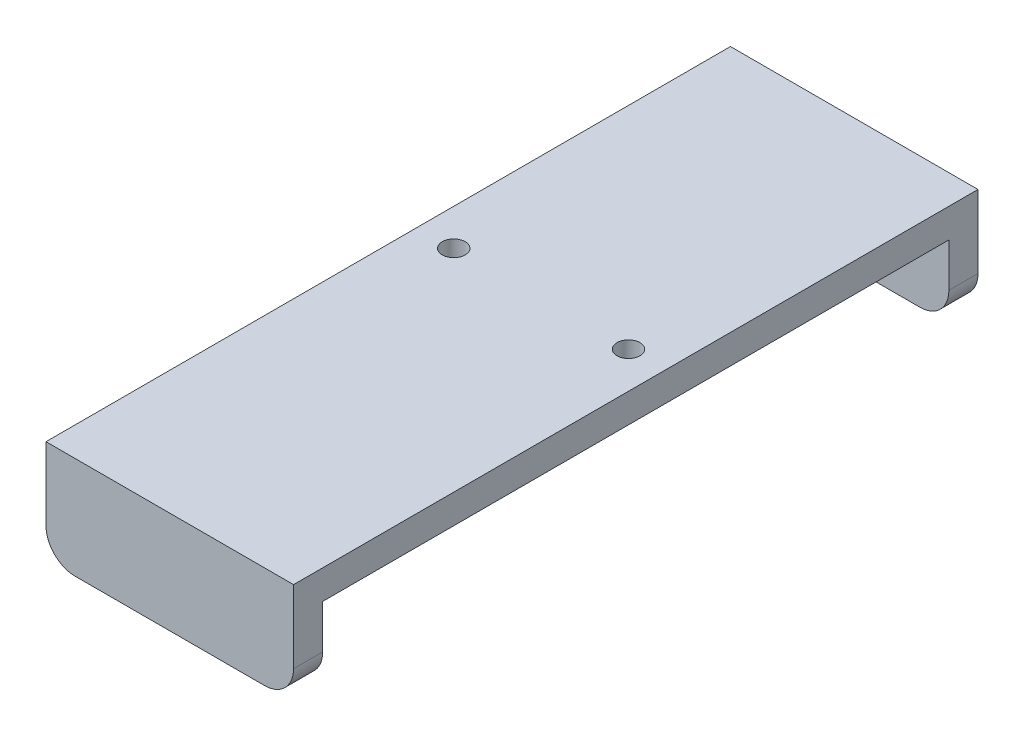
ISO-10303-21;
HEADER;
FILE_DESCRIPTION(('STEP AP214'),'2;1');
FILE_NAME('part.step','',(''),(''),'','','');
FILE_SCHEMA(('AUTOMOTIVE_DESIGN { 1 0 10303 214 1 1 1 1 }'));
ENDSEC;
DATA;
#1=APPLICATION_CONTEXT('core data for automotive mechanical design processes');
#2=APPLICATION_PROTOCOL_DEFINITION('international standard','automotive_design',2000,#1);
#3=PRODUCT_CONTEXT('',#1,'mechanical');
#4=PRODUCT('Part','Part','',(#3));
#5=PRODUCT_RELATED_PRODUCT_CATEGORY('part','',(#4));
#6=PRODUCT_DEFINITION_FORMATION('','',#4);
#7=PRODUCT_DEFINITION_CONTEXT('part definition',#1,'design');
#8=PRODUCT_DEFINITION('design','',#6,#7);
#9=PRODUCT_DEFINITION_SHAPE('','',#8);
#10=(LENGTH_UNIT() NAMED_UNIT(*) SI_UNIT(.MILLI.,.METRE.));
#11=(NAMED_UNIT(*) PLANE_ANGLE_UNIT() SI_UNIT($,.RADIAN.));
#12=(NAMED_UNIT(*) SI_UNIT($,.STERADIAN.) SOLID_ANGLE_UNIT());
#13=UNCERTAINTY_MEASURE_WITH_UNIT(LENGTH_MEASURE(1.E-05),#10,'distance_accuracy_value','');
#14=(GEOMETRIC_REPRESENTATION_CONTEXT(3) GLOBAL_UNCERTAINTY_ASSIGNED_CONTEXT((#13)) GLOBAL_UNIT_ASSIGNED_CONTEXT((#10,
#11,#12)) REPRESENTATION_CONTEXT('',''));
#15=CARTESIAN_POINT('',(0.,0.,0.));
#16=DIRECTION('',(0.,0.,1.));
#17=DIRECTION('',(1.,0.,0.));
#18=AXIS2_PLACEMENT_3D('',#15,#16,#17);
#19=CARTESIAN_POINT('',(21.59,0.,29.845));
#20=DIRECTION('',(0.,0.,-1.));
#21=DIRECTION('',(-1.,0.,0.));
#22=AXIS2_PLACEMENT_3D('',#19,#20,#21);
#23=PLANE('',#22);
#24=DIRECTION('',(0.,1.,0.));
#25=VECTOR('',#24,1.);
#26=CARTESIAN_POINT('',(0.,0.,29.845));
#27=LINE('',#26,#25);
#28=CARTESIAN_POINT('',(0.,2.54,29.845));
#29=VERTEX_POINT('',#28);
#30=CARTESIAN_POINT('',(0.,-3.81,29.845));
#31=VERTEX_POINT('',#30);
#32=EDGE_CURVE('E173',#29,#31,#27,.F.);
#33=ORIENTED_EDGE('',*,*,#32,.T.);
#34=CARTESIAN_POINT('',(2.54,-3.81,29.845));
#35=DIRECTION('',(0.,0.,-1.));
#36=DIRECTION('',(-1.,0.,0.));
#37=AXIS2_PLACEMENT_3D('',#34,#35,#36);
#38=CIRCLE('',#37,2.54);
#39=CARTESIAN_POINT('',(2.54,-6.35,29.845));
#40=VERTEX_POINT('',#39);
#41=EDGE_CURVE('E224',#31,#40,#38,.F.);
#42=ORIENTED_EDGE('',*,*,#41,.T.);
#43=DIRECTION('',(-1.,0.,0.));
#44=VECTOR('',#43,1.);
#45=CARTESIAN_POINT('',(21.59,-6.35,29.845));
#46=LINE('',#45,#44);
#47=CARTESIAN_POINT('',(19.05,-6.35,29.845));
#48=VERTEX_POINT('',#47);
#49=EDGE_CURVE('E209',#48,#40,#46,.T.);
#50=ORIENTED_EDGE('',*,*,#49,.F.);
#51=CARTESIAN_POINT('',(19.05,-3.81,29.845));
#52=DIRECTION('',(0.,0.,-1.));
#53=DIRECTION('',(-1.,0.,0.));
#54=AXIS2_PLACEMENT_3D('',#51,#52,#53);
#55=CIRCLE('',#54,2.54);
#56=CARTESIAN_POINT('',(21.59,-3.81,29.845));
#57=VERTEX_POINT('',#56);
#58=EDGE_CURVE('E221',#48,#57,#55,.F.);
#59=ORIENTED_EDGE('',*,*,#58,.T.);
#60=DIRECTION('',(0.,1.,0.));
#61=VECTOR('',#60,1.);
#62=CARTESIAN_POINT('',(21.59,0.,29.845));
#63=LINE('',#62,#61);
#64=CARTESIAN_POINT('',(21.59,2.54,29.845));
#65=VERTEX_POINT('',#64);
#66=EDGE_CURVE('E154',#65,#57,#63,.F.);
#67=ORIENTED_EDGE('',*,*,#66,.F.);
#68=DIRECTION('',(-1.,0.,0.));
#69=VECTOR('',#68,1.);
#70=CARTESIAN_POINT('',(21.59,2.54,29.845));
#71=LINE('',#70,#69);
#72=EDGE_CURVE('E172',#65,#29,#71,.T.);
#73=ORIENTED_EDGE('',*,*,#72,.T.);
#74=EDGE_LOOP('',(#33,#42,#50,#59,#67,#73));
#75=FACE_BOUND('',#74,.T.);
#76=ADVANCED_FACE('F39',(#75),#23,.F.);
#77=CARTESIAN_POINT('',(21.59,-6.35,27.305));
#78=DIRECTION('',(0.,-1.,0.));
#79=DIRECTION('',(0.,0.,-1.));
#80=AXIS2_PLACEMENT_3D('',#77,#78,#79);
#81=PLANE('',#80);
#82=ORIENTED_EDGE('',*,*,#49,.T.);
#83=DIRECTION('',(0.,0.,1.));
#84=VECTOR('',#83,1.);
#85=CARTESIAN_POINT('',(2.54,-6.35,27.305));
#86=LINE('',#85,#84);
#87=CARTESIAN_POINT('',(2.54,-6.35,27.305));
#88=VERTEX_POINT('',#87);
#89=EDGE_CURVE('E231',#40,#88,#86,.F.);
#90=ORIENTED_EDGE('',*,*,#89,.T.);
#91=DIRECTION('',(-1.,0.,0.));
#92=VECTOR('',#91,1.);
#93=CARTESIAN_POINT('',(21.59,-6.35,27.305));
#94=LINE('',#93,#92);
#95=CARTESIAN_POINT('',(19.05,-6.35,27.305));
#96=VERTEX_POINT('',#95);
#97=EDGE_CURVE('E142',#96,#88,#94,.T.);
#98=ORIENTED_EDGE('',*,*,#97,.F.);
#99=DIRECTION('',(0.,0.,1.));
#100=VECTOR('',#99,1.);
#101=CARTESIAN_POINT('',(19.05,-6.35,27.305));
#102=LINE('',#101,#100);
#103=EDGE_CURVE('E227',#96,#48,#102,.T.);
#104=ORIENTED_EDGE('',*,*,#103,.T.);
#105=EDGE_LOOP('',(#82,#90,#98,#104));
#106=FACE_BOUND('',#105,.T.);
#107=ADVANCED_FACE('F287',(#106),#81,.T.);
#108=CARTESIAN_POINT('',(21.59,0.,27.305));
#109=DIRECTION('',(0.,0.,-1.));
#110=DIRECTION('',(-1.,0.,0.));
#111=AXIS2_PLACEMENT_3D('',#108,#109,#110);
#112=PLANE('',#111);
#113=ORIENTED_EDGE('',*,*,#97,.T.);
#114=CARTESIAN_POINT('',(2.54,-3.81,27.305));
#115=DIRECTION('',(0.,0.,-1.));
#116=DIRECTION('',(-1.,0.,0.));
#117=AXIS2_PLACEMENT_3D('',#114,#115,#116);
#118=CIRCLE('',#117,2.54);
#119=CARTESIAN_POINT('',(0.,-3.81,27.305));
#120=VERTEX_POINT('',#119);
#121=EDGE_CURVE('E237',#88,#120,#118,.T.);
#122=ORIENTED_EDGE('',*,*,#121,.T.);
#123=DIRECTION('',(0.,-1.,0.));
#124=VECTOR('',#123,1.);
#125=CARTESIAN_POINT('',(0.,0.,27.305));
#126=LINE('',#125,#124);
#127=CARTESIAN_POINT('',(0.,0.,27.305));
#128=VERTEX_POINT('',#127);
#129=EDGE_CURVE('E136',#128,#120,#126,.T.);
#130=ORIENTED_EDGE('',*,*,#129,.F.);
#131=DIRECTION('',(-1.,0.,0.));
#132=VECTOR('',#131,1.);
#133=CARTESIAN_POINT('',(21.59,0.,27.305));
#134=LINE('',#133,#132);
#135=CARTESIAN_POINT('',(21.59,0.,27.305));
#136=VERTEX_POINT('',#135);
#137=EDGE_CURVE('E129',#136,#128,#134,.T.);
#138=ORIENTED_EDGE('',*,*,#137,.F.);
#139=DIRECTION('',(0.,-1.,0.));
#140=VECTOR('',#139,1.);
#141=CARTESIAN_POINT('',(21.59,0.,27.305));
#142=LINE('',#141,#140);
#143=CARTESIAN_POINT('',(21.59,-3.81,27.305));
#144=VERTEX_POINT('',#143);
#145=EDGE_CURVE('E133',#136,#144,#142,.T.);
#146=ORIENTED_EDGE('',*,*,#145,.T.);
#147=CARTESIAN_POINT('',(19.05,-3.81,27.305));
#148=DIRECTION('',(0.,0.,-1.));
#149=DIRECTION('',(-1.,0.,0.));
#150=AXIS2_PLACEMENT_3D('',#147,#148,#149);
#151=CIRCLE('',#150,2.54);
#152=EDGE_CURVE('E234',#144,#96,#151,.T.);
#153=ORIENTED_EDGE('',*,*,#152,.T.);
#154=EDGE_LOOP('',(#113,#122,#130,#138,#146,#153));
#155=FACE_BOUND('',#154,.T.);
#156=ADVANCED_FACE('F132',(#155),#112,.T.);
#157=CARTESIAN_POINT('',(21.59,0.,27.305));
#158=DIRECTION('',(0.,-1.,0.));
#159=DIRECTION('',(0.,0.,-1.));
#160=AXIS2_PLACEMENT_3D('',#157,#158,#159);
#161=PLANE('',#160);
#162=CARTESIAN_POINT('',(3.175,0.,-2.54));
#163=DIRECTION('',(0.,-1.,0.));
#164=DIRECTION('',(0.,0.,-1.));
#165=AXIS2_PLACEMENT_3D('',#162,#163,#164);
#166=CIRCLE('',#165,1.);
#167=CARTESIAN_POINT('',(3.175,0.,-3.54));
#168=VERTEX_POINT('',#167);
#169=EDGE_CURVE('E322',#168,#168,#166,.F.);
#170=ORIENTED_EDGE('',*,*,#169,.T.);
#171=EDGE_LOOP('',(#170));
#172=FACE_BOUND('',#171,.T.);
#173=CARTESIAN_POINT('',(18.415,0.,-2.54));
#174=DIRECTION('',(0.,-1.,0.));
#175=DIRECTION('',(0.,0.,-1.));
#176=AXIS2_PLACEMENT_3D('',#173,#174,#175);
#177=CIRCLE('',#176,1.);
#178=CARTESIAN_POINT('',(18.415,0.,-3.54));
#179=VERTEX_POINT('',#178);
#180=EDGE_CURVE('E314',#179,#179,#177,.F.);
#181=ORIENTED_EDGE('',*,*,#180,.T.);
#182=EDGE_LOOP('',(#181));
#183=FACE_BOUND('',#182,.T.);
#184=DIRECTION('',(0.,0.,1.));
#185=VECTOR('',#184,1.);
#186=CARTESIAN_POINT('',(0.,0.,27.305));
#187=LINE('',#186,#185);
#188=CARTESIAN_POINT('',(0.,0.,-27.305));
#189=VERTEX_POINT('',#188);
#190=EDGE_CURVE('E180',#189,#128,#187,.T.);
#191=ORIENTED_EDGE('',*,*,#190,.F.);
#192=DIRECTION('',(-1.,0.,0.));
#193=VECTOR('',#192,1.);
#194=CARTESIAN_POINT('',(21.59,0.,-27.305));
#195=LINE('',#194,#193);
#196=CARTESIAN_POINT('',(21.59,0.,-27.305));
#197=VERTEX_POINT('',#196);
#198=EDGE_CURVE('E143',#197,#189,#195,.T.);
#199=ORIENTED_EDGE('',*,*,#198,.F.);
#200=DIRECTION('',(0.,0.,1.));
#201=VECTOR('',#200,1.);
#202=CARTESIAN_POINT('',(21.59,0.,27.305));
#203=LINE('',#202,#201);
#204=EDGE_CURVE('E150',#197,#136,#203,.T.);
#205=ORIENTED_EDGE('',*,*,#204,.T.);
#206=ORIENTED_EDGE('',*,*,#137,.T.);
#207=EDGE_LOOP('',(#191,#199,#205,#206));
#208=FACE_BOUND('',#207,.T.);
#209=ADVANCED_FACE('F157',(#172,#183,#208),#161,.T.);
#210=CARTESIAN_POINT('',(21.59,0.,-27.305));
#211=DIRECTION('',(0.,0.,1.));
#212=DIRECTION('',(1.,0.,0.));
#213=AXIS2_PLACEMENT_3D('',#210,#211,#212);
#214=PLANE('',#213);
#215=DIRECTION('',(0.,1.,0.));
#216=VECTOR('',#215,1.);
#217=CARTESIAN_POINT('',(0.,0.,-27.305));
#218=LINE('',#217,#216);
#219=CARTESIAN_POINT('',(0.,-3.80999999999999,-27.305));
#220=VERTEX_POINT('',#219);
#221=EDGE_CURVE('E183',#220,#189,#218,.T.);
#222=ORIENTED_EDGE('',*,*,#221,.F.);
#223=CARTESIAN_POINT('',(2.54,-3.80999999999999,-27.305));
#224=DIRECTION('',(0.,0.,1.));
#225=DIRECTION('',(1.,0.,0.));
#226=AXIS2_PLACEMENT_3D('',#223,#224,#225);
#227=CIRCLE('',#226,2.54);
#228=CARTESIAN_POINT('',(2.54,-6.34999999999999,-27.305));
#229=VERTEX_POINT('',#228);
#230=EDGE_CURVE('E248',#220,#229,#227,.T.);
#231=ORIENTED_EDGE('',*,*,#230,.T.);
#232=DIRECTION('',(-1.,0.,0.));
#233=VECTOR('',#232,1.);
#234=CARTESIAN_POINT('',(21.59,-6.34999999999999,-27.305));
#235=LINE('',#234,#233);
#236=CARTESIAN_POINT('',(19.05,-6.34999999999999,-27.305));
#237=VERTEX_POINT('',#236);
#238=EDGE_CURVE('E202',#237,#229,#235,.T.);
#239=ORIENTED_EDGE('',*,*,#238,.F.);
#240=CARTESIAN_POINT('',(19.05,-3.80999999999999,-27.305));
#241=DIRECTION('',(0.,0.,1.));
#242=DIRECTION('',(1.,0.,0.));
#243=AXIS2_PLACEMENT_3D('',#240,#241,#242);
#244=CIRCLE('',#243,2.54);
#245=CARTESIAN_POINT('',(21.59,-3.80999999999999,-27.305));
#246=VERTEX_POINT('',#245);
#247=EDGE_CURVE('E245',#237,#246,#244,.T.);
#248=ORIENTED_EDGE('',*,*,#247,.T.);
#249=DIRECTION('',(0.,1.,0.));
#250=VECTOR('',#249,1.);
#251=CARTESIAN_POINT('',(21.59,0.,-27.305));
#252=LINE('',#251,#250);
#253=EDGE_CURVE('E160',#246,#197,#252,.T.);
#254=ORIENTED_EDGE('',*,*,#253,.T.);
#255=ORIENTED_EDGE('',*,*,#198,.T.);
#256=EDGE_LOOP('',(#222,#231,#239,#248,#254,#255));
#257=FACE_BOUND('',#256,.T.);
#258=ADVANCED_FACE('F263',(#257),#214,.T.);
#259=CARTESIAN_POINT('',(21.59,-6.34999999999999,-29.845));
#260=DIRECTION('',(0.,-1.,0.));
#261=DIRECTION('',(0.,0.,-1.));
#262=AXIS2_PLACEMENT_3D('',#259,#260,#261);
#263=PLANE('',#262);
#264=ORIENTED_EDGE('',*,*,#238,.T.);
#265=DIRECTION('',(0.,0.,1.));
#266=VECTOR('',#265,1.);
#267=CARTESIAN_POINT('',(2.54,-6.34999999999999,-29.845));
#268=LINE('',#267,#266);
#269=CARTESIAN_POINT('',(2.54,-6.34999999999999,-29.845));
#270=VERTEX_POINT('',#269);
#271=EDGE_CURVE('E55',#229,#270,#268,.F.);
#272=ORIENTED_EDGE('',*,*,#271,.T.);
#273=DIRECTION('',(-1.,0.,0.));
#274=VECTOR('',#273,1.);
#275=CARTESIAN_POINT('',(21.59,-6.34999999999999,-29.845));
#276=LINE('',#275,#274);
#277=CARTESIAN_POINT('',(19.05,-6.34999999999999,-29.845));
#278=VERTEX_POINT('',#277);
#279=EDGE_CURVE('E199',#278,#270,#276,.T.);
#280=ORIENTED_EDGE('',*,*,#279,.F.);
#281=DIRECTION('',(0.,0.,1.));
#282=VECTOR('',#281,1.);
#283=CARTESIAN_POINT('',(19.05,-6.34999999999999,-29.845));
#284=LINE('',#283,#282);
#285=EDGE_CURVE('E251',#278,#237,#284,.T.);
#286=ORIENTED_EDGE('',*,*,#285,.T.);
#287=EDGE_LOOP('',(#264,#272,#280,#286));
#288=FACE_BOUND('',#287,.T.);
#289=ADVANCED_FACE('F259',(#288),#263,.T.);
#290=CARTESIAN_POINT('',(21.59,0.,-29.845));
#291=DIRECTION('',(0.,0.,1.));
#292=DIRECTION('',(1.,0.,0.));
#293=AXIS2_PLACEMENT_3D('',#290,#291,#292);
#294=PLANE('',#293);
#295=ORIENTED_EDGE('',*,*,#279,.T.);
#296=CARTESIAN_POINT('',(2.54,-3.80999999999999,-29.845));
#297=DIRECTION('',(0.,0.,1.));
#298=DIRECTION('',(1.,0.,0.));
#299=AXIS2_PLACEMENT_3D('',#296,#297,#298);
#300=CIRCLE('',#299,2.54);
#301=CARTESIAN_POINT('',(0.,-3.80999999999999,-29.845));
#302=VERTEX_POINT('',#301);
#303=EDGE_CURVE('E11',#270,#302,#300,.F.);
#304=ORIENTED_EDGE('',*,*,#303,.T.);
#305=DIRECTION('',(0.,1.,0.));
#306=VECTOR('',#305,1.);
#307=CARTESIAN_POINT('',(0.,0.,-29.845));
#308=LINE('',#307,#306);
#309=CARTESIAN_POINT('',(0.,2.54000000000001,-29.845));
#310=VERTEX_POINT('',#309);
#311=EDGE_CURVE('E186',#302,#310,#308,.T.);
#312=ORIENTED_EDGE('',*,*,#311,.T.);
#313=DIRECTION('',(-1.,0.,0.));
#314=VECTOR('',#313,1.);
#315=CARTESIAN_POINT('',(21.59,2.54000000000001,-29.845));
#316=LINE('',#315,#314);
#317=CARTESIAN_POINT('',(21.59,2.54000000000001,-29.845));
#318=VERTEX_POINT('',#317);
#319=EDGE_CURVE('E195',#318,#310,#316,.T.);
#320=ORIENTED_EDGE('',*,*,#319,.F.);
#321=DIRECTION('',(0.,1.,0.));
#322=VECTOR('',#321,1.);
#323=CARTESIAN_POINT('',(21.59,0.,-29.845));
#324=LINE('',#323,#322);
#325=CARTESIAN_POINT('',(21.59,-3.80999999999999,-29.845));
#326=VERTEX_POINT('',#325);
#327=EDGE_CURVE('E163',#326,#318,#324,.T.);
#328=ORIENTED_EDGE('',*,*,#327,.F.);
#329=CARTESIAN_POINT('',(19.05,-3.80999999999999,-29.845));
#330=DIRECTION('',(0.,0.,1.));
#331=DIRECTION('',(1.,0.,0.));
#332=AXIS2_PLACEMENT_3D('',#329,#330,#331);
#333=CIRCLE('',#332,2.54);
#334=EDGE_CURVE('E48',#326,#278,#333,.F.);
#335=ORIENTED_EDGE('',*,*,#334,.T.);
#336=EDGE_LOOP('',(#295,#304,#312,#320,#328,#335));
#337=FACE_BOUND('',#336,.T.);
#338=ADVANCED_FACE('F274',(#337),#294,.F.);
#339=CARTESIAN_POINT('',(21.59,2.54,27.305));
#340=DIRECTION('',(0.,-1.,0.));
#341=DIRECTION('',(0.,0.,-1.));
#342=AXIS2_PLACEMENT_3D('',#339,#340,#341);
#343=PLANE('',#342);
#344=CARTESIAN_POINT('',(3.175,2.54000000000001,-2.54));
#345=DIRECTION('',(0.,1.,0.));
#346=DIRECTION('',(0.,0.,1.));
#347=AXIS2_PLACEMENT_3D('',#344,#345,#346);
#348=CIRCLE('',#347,1.);
#349=CARTESIAN_POINT('',(3.175,2.54000000000001,-1.54));
#350=VERTEX_POINT('',#349);
#351=EDGE_CURVE('E177',#350,#350,#348,.T.);
#352=ORIENTED_EDGE('',*,*,#351,.F.);
#353=EDGE_LOOP('',(#352));
#354=FACE_BOUND('',#353,.T.);
#355=CARTESIAN_POINT('',(18.415,2.54000000000001,-2.54));
#356=DIRECTION('',(0.,1.,0.));
#357=DIRECTION('',(0.,0.,1.));
#358=AXIS2_PLACEMENT_3D('',#355,#356,#357);
#359=CIRCLE('',#358,1.);
#360=CARTESIAN_POINT('',(18.415,2.54000000000001,-1.54));
#361=VERTEX_POINT('',#360);
#362=EDGE_CURVE('E318',#361,#361,#359,.T.);
#363=ORIENTED_EDGE('',*,*,#362,.F.);
#364=EDGE_LOOP('',(#363));
#365=FACE_BOUND('',#364,.T.);
#366=DIRECTION('',(0.,0.,1.));
#367=VECTOR('',#366,1.);
#368=CARTESIAN_POINT('',(0.,2.54,27.305));
#369=LINE('',#368,#367);
#370=EDGE_CURVE('E189',#310,#29,#369,.T.);
#371=ORIENTED_EDGE('',*,*,#370,.T.);
#372=ORIENTED_EDGE('',*,*,#72,.F.);
#373=DIRECTION('',(0.,0.,1.));
#374=VECTOR('',#373,1.);
#375=CARTESIAN_POINT('',(21.59,2.54,27.305));
#376=LINE('',#375,#374);
#377=EDGE_CURVE('E169',#318,#65,#376,.T.);
#378=ORIENTED_EDGE('',*,*,#377,.F.);
#379=ORIENTED_EDGE('',*,*,#319,.T.);
#380=EDGE_LOOP('',(#371,#372,#378,#379));
#381=FACE_BOUND('',#380,.T.);
#382=ADVANCED_FACE('F277',(#354,#365,#381),#343,.F.);
#383=CARTESIAN_POINT('',(21.59,0.,0.));
#384=DIRECTION('',(1.,0.,0.));
#385=DIRECTION('',(0.,0.,-1.));
#386=AXIS2_PLACEMENT_3D('',#383,#384,#385);
#387=PLANE('',#386);
#388=ORIENTED_EDGE('',*,*,#66,.T.);
#389=DIRECTION('',(0.,0.,1.));
#390=VECTOR('',#389,1.);
#391=CARTESIAN_POINT('',(21.59,-3.81,0.));
#392=LINE('',#391,#390);
#393=EDGE_CURVE('E152',#57,#144,#392,.F.);
#394=ORIENTED_EDGE('',*,*,#393,.T.);
#395=ORIENTED_EDGE('',*,*,#145,.F.);
#396=ORIENTED_EDGE('',*,*,#204,.F.);
#397=ORIENTED_EDGE('',*,*,#253,.F.);
#398=DIRECTION('',(0.,0.,1.));
#399=VECTOR('',#398,1.);
#400=CARTESIAN_POINT('',(21.59,-3.80999999999999,0.));
#401=LINE('',#400,#399);
#402=EDGE_CURVE('E240',#246,#326,#401,.F.);
#403=ORIENTED_EDGE('',*,*,#402,.T.);
#404=ORIENTED_EDGE('',*,*,#327,.T.);
#405=ORIENTED_EDGE('',*,*,#377,.T.);
#406=EDGE_LOOP('',(#388,#394,#395,#396,#397,#403,#404,#405));
#407=FACE_BOUND('',#406,.T.);
#408=ADVANCED_FACE('F148',(#407),#387,.T.);
#409=CARTESIAN_POINT('',(0.,0.,0.));
#410=DIRECTION('',(1.,0.,0.));
#411=DIRECTION('',(0.,0.,-1.));
#412=AXIS2_PLACEMENT_3D('',#409,#410,#411);
#413=PLANE('',#412);
#414=ORIENTED_EDGE('',*,*,#129,.T.);
#415=DIRECTION('',(0.,0.,1.));
#416=VECTOR('',#415,1.);
#417=CARTESIAN_POINT('',(0.,-3.81,29.845));
#418=LINE('',#417,#416);
#419=EDGE_CURVE('E217',#120,#31,#418,.T.);
#420=ORIENTED_EDGE('',*,*,#419,.T.);
#421=ORIENTED_EDGE('',*,*,#32,.F.);
#422=ORIENTED_EDGE('',*,*,#370,.F.);
#423=ORIENTED_EDGE('',*,*,#311,.F.);
#424=DIRECTION('',(0.,0.,1.));
#425=VECTOR('',#424,1.);
#426=CARTESIAN_POINT('',(0.,-3.80999999999999,-27.305));
#427=LINE('',#426,#425);
#428=EDGE_CURVE('E213',#302,#220,#427,.T.);
#429=ORIENTED_EDGE('',*,*,#428,.T.);
#430=ORIENTED_EDGE('',*,*,#221,.T.);
#431=ORIENTED_EDGE('',*,*,#190,.T.);
#432=EDGE_LOOP('',(#414,#420,#421,#422,#423,#429,#430,#431));
#433=FACE_BOUND('',#432,.T.);
#434=ADVANCED_FACE('F270',(#433),#413,.F.);
#435=CARTESIAN_POINT('',(18.415,-6.35100000000001,-2.54));
#436=DIRECTION('',(0.,1.,0.));
#437=DIRECTION('',(0.,0.,1.));
#438=AXIS2_PLACEMENT_3D('',#435,#436,#437);
#439=CYLINDRICAL_SURFACE('',#438,1.);
#440=ORIENTED_EDGE('',*,*,#180,.F.);
#441=EDGE_LOOP('',(#440));
#442=FACE_BOUND('',#441,.T.);
#443=ORIENTED_EDGE('',*,*,#362,.T.);
#444=EDGE_LOOP('',(#443));
#445=FACE_BOUND('',#444,.T.);
#446=ADVANCED_FACE('F336',(#442,#445),#439,.F.);
#447=CARTESIAN_POINT('',(3.175,-6.35100000000001,-2.54));
#448=DIRECTION('',(0.,1.,0.));
#449=DIRECTION('',(0.,0.,1.));
#450=AXIS2_PLACEMENT_3D('',#447,#448,#449);
#451=CYLINDRICAL_SURFACE('',#450,1.);
#452=ORIENTED_EDGE('',*,*,#169,.F.);
#453=EDGE_LOOP('',(#452));
#454=FACE_BOUND('',#453,.T.);
#455=ORIENTED_EDGE('',*,*,#351,.T.);
#456=EDGE_LOOP('',(#455));
#457=FACE_BOUND('',#456,.T.);
#458=ADVANCED_FACE('F300',(#454,#457),#451,.F.);
#459=CARTESIAN_POINT('',(2.54,-3.81,0.));
#460=DIRECTION('',(0.,0.,-1.));
#461=DIRECTION('',(-1.,0.,0.));
#462=AXIS2_PLACEMENT_3D('',#459,#460,#461);
#463=CYLINDRICAL_SURFACE('',#462,2.54);
#464=ORIENTED_EDGE('',*,*,#121,.F.);
#465=ORIENTED_EDGE('',*,*,#89,.F.);
#466=ORIENTED_EDGE('',*,*,#41,.F.);
#467=ORIENTED_EDGE('',*,*,#419,.F.);
#468=EDGE_LOOP('',(#464,#465,#466,#467));
#469=FACE_BOUND('',#468,.T.);
#470=ADVANCED_FACE('F297',(#469),#463,.T.);
#471=CARTESIAN_POINT('',(19.05,-3.81,27.305));
#472=DIRECTION('',(0.,0.,1.));
#473=DIRECTION('',(1.,0.,0.));
#474=AXIS2_PLACEMENT_3D('',#471,#472,#473);
#475=CYLINDRICAL_SURFACE('',#474,2.54);
#476=ORIENTED_EDGE('',*,*,#152,.F.);
#477=ORIENTED_EDGE('',*,*,#393,.F.);
#478=ORIENTED_EDGE('',*,*,#58,.F.);
#479=ORIENTED_EDGE('',*,*,#103,.F.);
#480=EDGE_LOOP('',(#476,#477,#478,#479));
#481=FACE_BOUND('',#480,.T.);
#482=ADVANCED_FACE('F285',(#481),#475,.T.);
#483=CARTESIAN_POINT('',(2.54,-3.80999999999999,0.));
#484=DIRECTION('',(0.,0.,-1.));
#485=DIRECTION('',(-1.,0.,0.));
#486=AXIS2_PLACEMENT_3D('',#483,#484,#485);
#487=CYLINDRICAL_SURFACE('',#486,2.54);
#488=ORIENTED_EDGE('',*,*,#303,.F.);
#489=ORIENTED_EDGE('',*,*,#271,.F.);
#490=ORIENTED_EDGE('',*,*,#230,.F.);
#491=ORIENTED_EDGE('',*,*,#428,.F.);
#492=EDGE_LOOP('',(#488,#489,#490,#491));
#493=FACE_BOUND('',#492,.T.);
#494=ADVANCED_FACE('F267',(#493),#487,.T.);
#495=CARTESIAN_POINT('',(19.05,-3.80999999999999,-29.845));
#496=DIRECTION('',(0.,0.,1.));
#497=DIRECTION('',(1.,0.,0.));
#498=AXIS2_PLACEMENT_3D('',#495,#496,#497);
#499=CYLINDRICAL_SURFACE('',#498,2.54);
#500=ORIENTED_EDGE('',*,*,#334,.F.);
#501=ORIENTED_EDGE('',*,*,#402,.F.);
#502=ORIENTED_EDGE('',*,*,#247,.F.);
#503=ORIENTED_EDGE('',*,*,#285,.F.);
#504=EDGE_LOOP('',(#500,#501,#502,#503));
#505=FACE_BOUND('',#504,.T.);
#506=ADVANCED_FACE('F41',(#505),#499,.T.);
#507=CLOSED_SHELL('',(#76,#107,#156,#209,#258,#289,#338,#382,#408,#434,#446,#458,#470,#482,#494,#506));
#508=MANIFOLD_SOLID_BREP('B2',#507);
#509=ADVANCED_BREP_SHAPE_REPRESENTATION('',(#18,#508),#14);
#510=SHAPE_DEFINITION_REPRESENTATION(#9,#509);
ENDSEC;
END-ISO-10303-21;
